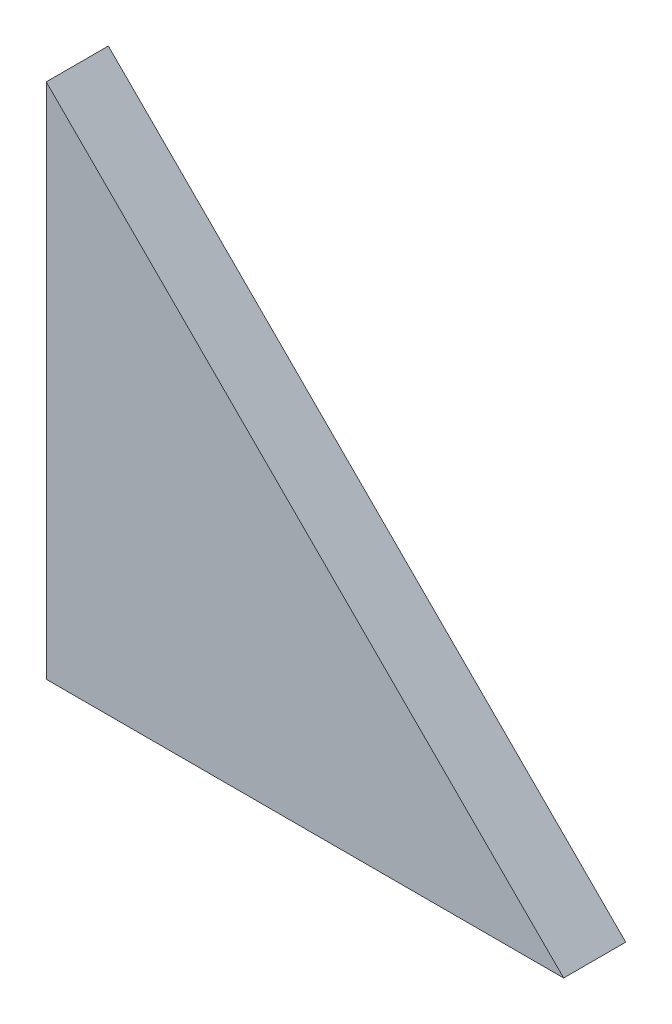
ISO-10303-21;
HEADER;
FILE_DESCRIPTION(('STEP AP214'),'2;1');
FILE_NAME('part.step','',(''),(''),'','','');
FILE_SCHEMA(('AUTOMOTIVE_DESIGN { 1 0 10303 214 1 1 1 1 }'));
ENDSEC;
DATA;
#1=APPLICATION_CONTEXT('core data for automotive mechanical design processes');
#2=APPLICATION_PROTOCOL_DEFINITION('international standard','automotive_design',2000,#1);
#3=PRODUCT_CONTEXT('',#1,'mechanical');
#4=PRODUCT('Part','Part','',(#3));
#5=PRODUCT_RELATED_PRODUCT_CATEGORY('part','',(#4));
#6=PRODUCT_DEFINITION_FORMATION('','',#4);
#7=PRODUCT_DEFINITION_CONTEXT('part definition',#1,'design');
#8=PRODUCT_DEFINITION('design','',#6,#7);
#9=PRODUCT_DEFINITION_SHAPE('','',#8);
#10=(LENGTH_UNIT() NAMED_UNIT(*) SI_UNIT(.MILLI.,.METRE.));
#11=(NAMED_UNIT(*) PLANE_ANGLE_UNIT() SI_UNIT($,.RADIAN.));
#12=(NAMED_UNIT(*) SI_UNIT($,.STERADIAN.) SOLID_ANGLE_UNIT());
#13=UNCERTAINTY_MEASURE_WITH_UNIT(LENGTH_MEASURE(1.E-05),#10,'distance_accuracy_value','');
#14=(GEOMETRIC_REPRESENTATION_CONTEXT(3) GLOBAL_UNCERTAINTY_ASSIGNED_CONTEXT((#13)) GLOBAL_UNIT_ASSIGNED_CONTEXT((#10,
#11,#12)) REPRESENTATION_CONTEXT('',''));
#15=CARTESIAN_POINT('',(0.,0.,0.));
#16=DIRECTION('',(0.,0.,1.));
#17=DIRECTION('',(1.,0.,0.));
#18=AXIS2_PLACEMENT_3D('',#15,#16,#17);
#19=CARTESIAN_POINT('',(0.,0.,1.5));
#20=DIRECTION('',(0.,1.,0.));
#21=DIRECTION('',(0.,0.,1.));
#22=AXIS2_PLACEMENT_3D('',#19,#20,#21);
#23=PLANE('',#22);
#24=DIRECTION('',(1.,0.,0.));
#25=VECTOR('',#24,1.);
#26=CARTESIAN_POINT('',(0.,0.,-1.5));
#27=LINE('',#26,#25);
#28=CARTESIAN_POINT('',(0.,0.,-1.5));
#29=VERTEX_POINT('',#28);
#30=CARTESIAN_POINT('',(25.,0.,-1.5));
#31=VERTEX_POINT('',#30);
#32=EDGE_CURVE('E94',#29,#31,#27,.T.);
#33=ORIENTED_EDGE('',*,*,#32,.T.);
#34=DIRECTION('',(0.,0.,-1.));
#35=VECTOR('',#34,1.);
#36=CARTESIAN_POINT('',(25.,0.,1.5));
#37=LINE('',#36,#35);
#38=CARTESIAN_POINT('',(25.,0.,1.5));
#39=VERTEX_POINT('',#38);
#40=EDGE_CURVE('E11',#39,#31,#37,.T.);
#41=ORIENTED_EDGE('',*,*,#40,.F.);
#42=DIRECTION('',(1.,0.,0.));
#43=VECTOR('',#42,1.);
#44=CARTESIAN_POINT('',(0.,0.,1.5));
#45=LINE('',#44,#43);
#46=CARTESIAN_POINT('',(0.,0.,1.5));
#47=VERTEX_POINT('',#46);
#48=EDGE_CURVE('E87',#47,#39,#45,.T.);
#49=ORIENTED_EDGE('',*,*,#48,.F.);
#50=DIRECTION('',(0.,0.,-1.));
#51=VECTOR('',#50,1.);
#52=CARTESIAN_POINT('',(0.,0.,1.5));
#53=LINE('',#52,#51);
#54=EDGE_CURVE('E95',#47,#29,#53,.T.);
#55=ORIENTED_EDGE('',*,*,#54,.T.);
#56=EDGE_LOOP('',(#33,#41,#49,#55));
#57=FACE_BOUND('',#56,.T.);
#58=ADVANCED_FACE('F47',(#57),#23,.F.);
#59=CARTESIAN_POINT('',(0.,25.,1.5));
#60=DIRECTION('',(-0.707106781186548,-0.707106781186548,0.));
#61=DIRECTION('',(0.707106781186548,-0.707106781186548,0.));
#62=AXIS2_PLACEMENT_3D('',#59,#60,#61);
#63=PLANE('',#62);
#64=DIRECTION('',(-0.707106781186547,0.707106781186547,0.));
#65=VECTOR('',#64,1.);
#66=CARTESIAN_POINT('',(0.,25.,-1.5));
#67=LINE('',#66,#65);
#68=CARTESIAN_POINT('',(0.,25.,-1.5));
#69=VERTEX_POINT('',#68);
#70=EDGE_CURVE('E75',#31,#69,#67,.T.);
#71=ORIENTED_EDGE('',*,*,#70,.T.);
#72=DIRECTION('',(0.,0.,-1.));
#73=VECTOR('',#72,1.);
#74=CARTESIAN_POINT('',(0.,25.,1.5));
#75=LINE('',#74,#73);
#76=CARTESIAN_POINT('',(0.,25.,1.5));
#77=VERTEX_POINT('',#76);
#78=EDGE_CURVE('E55',#77,#69,#75,.T.);
#79=ORIENTED_EDGE('',*,*,#78,.F.);
#80=DIRECTION('',(-0.707106781186547,0.707106781186547,0.));
#81=VECTOR('',#80,1.);
#82=CARTESIAN_POINT('',(0.,25.,1.5));
#83=LINE('',#82,#81);
#84=EDGE_CURVE('E83',#39,#77,#83,.T.);
#85=ORIENTED_EDGE('',*,*,#84,.F.);
#86=ORIENTED_EDGE('',*,*,#40,.T.);
#87=EDGE_LOOP('',(#71,#79,#85,#86));
#88=FACE_BOUND('',#87,.T.);
#89=ADVANCED_FACE('F84',(#88),#63,.F.);
#90=CARTESIAN_POINT('',(0.,25.,1.5));
#91=DIRECTION('',(1.,0.,0.));
#92=DIRECTION('',(0.,1.,0.));
#93=AXIS2_PLACEMENT_3D('',#90,#91,#92);
#94=PLANE('',#93);
#95=DIRECTION('',(0.,-1.,0.));
#96=VECTOR('',#95,1.);
#97=CARTESIAN_POINT('',(0.,25.,-1.5));
#98=LINE('',#97,#96);
#99=EDGE_CURVE('E80',#69,#29,#98,.T.);
#100=ORIENTED_EDGE('',*,*,#99,.T.);
#101=ORIENTED_EDGE('',*,*,#54,.F.);
#102=DIRECTION('',(0.,-1.,0.));
#103=VECTOR('',#102,1.);
#104=CARTESIAN_POINT('',(0.,25.,1.5));
#105=LINE('',#104,#103);
#106=EDGE_CURVE('E63',#77,#47,#105,.T.);
#107=ORIENTED_EDGE('',*,*,#106,.F.);
#108=ORIENTED_EDGE('',*,*,#78,.T.);
#109=EDGE_LOOP('',(#100,#101,#107,#108));
#110=FACE_BOUND('',#109,.T.);
#111=ADVANCED_FACE('F102',(#110),#94,.F.);
#112=CARTESIAN_POINT('',(0.,0.,1.5));
#113=DIRECTION('',(0.,0.,-1.));
#114=DIRECTION('',(-1.,0.,0.));
#115=AXIS2_PLACEMENT_3D('',#112,#113,#114);
#116=PLANE('',#115);
#117=ORIENTED_EDGE('',*,*,#48,.T.);
#118=ORIENTED_EDGE('',*,*,#84,.T.);
#119=ORIENTED_EDGE('',*,*,#106,.T.);
#120=EDGE_LOOP('',(#117,#118,#119));
#121=FACE_BOUND('',#120,.T.);
#122=ADVANCED_FACE('F90',(#121),#116,.F.);
#123=CARTESIAN_POINT('',(0.,0.,-1.5));
#124=DIRECTION('',(0.,0.,-1.));
#125=DIRECTION('',(-1.,0.,0.));
#126=AXIS2_PLACEMENT_3D('',#123,#124,#125);
#127=PLANE('',#126);
#128=ORIENTED_EDGE('',*,*,#32,.F.);
#129=ORIENTED_EDGE('',*,*,#99,.F.);
#130=ORIENTED_EDGE('',*,*,#70,.F.);
#131=EDGE_LOOP('',(#128,#129,#130));
#132=FACE_BOUND('',#131,.T.);
#133=ADVANCED_FACE('F103',(#132),#127,.T.);
#134=CLOSED_SHELL('',(#58,#89,#111,#122,#133));
#135=MANIFOLD_SOLID_BREP('B2',#134);
#136=ADVANCED_BREP_SHAPE_REPRESENTATION('',(#18,#135),#14);
#137=SHAPE_DEFINITION_REPRESENTATION(#9,#136);
ENDSEC;
END-ISO-10303-21;
